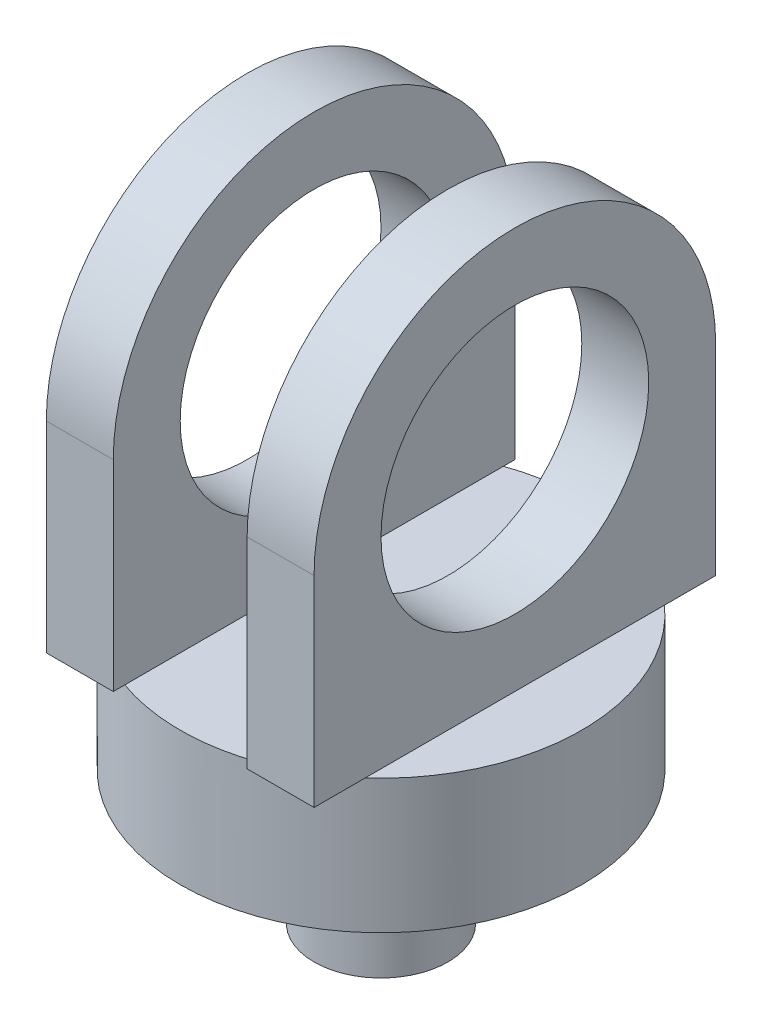
ISO-10303-21;
HEADER;
FILE_DESCRIPTION(('STEP AP214'),'2;1');
FILE_NAME('part.step','',(''),(''),'','','');
FILE_SCHEMA(('AUTOMOTIVE_DESIGN { 1 0 10303 214 1 1 1 1 }'));
ENDSEC;
DATA;
#1=APPLICATION_CONTEXT('core data for automotive mechanical design processes');
#2=APPLICATION_PROTOCOL_DEFINITION('international standard','automotive_design',2000,#1);
#3=PRODUCT_CONTEXT('',#1,'mechanical');
#4=PRODUCT('Part','Part','',(#3));
#5=PRODUCT_RELATED_PRODUCT_CATEGORY('part','',(#4));
#6=PRODUCT_DEFINITION_FORMATION('','',#4);
#7=PRODUCT_DEFINITION_CONTEXT('part definition',#1,'design');
#8=PRODUCT_DEFINITION('design','',#6,#7);
#9=PRODUCT_DEFINITION_SHAPE('','',#8);
#10=(LENGTH_UNIT() NAMED_UNIT(*) SI_UNIT(.MILLI.,.METRE.));
#11=(NAMED_UNIT(*) PLANE_ANGLE_UNIT() SI_UNIT($,.RADIAN.));
#12=(NAMED_UNIT(*) SI_UNIT($,.STERADIAN.) SOLID_ANGLE_UNIT());
#13=UNCERTAINTY_MEASURE_WITH_UNIT(LENGTH_MEASURE(1.E-05),#10,'distance_accuracy_value','');
#14=(GEOMETRIC_REPRESENTATION_CONTEXT(3) GLOBAL_UNCERTAINTY_ASSIGNED_CONTEXT((#13)) GLOBAL_UNIT_ASSIGNED_CONTEXT((#10,
#11,#12)) REPRESENTATION_CONTEXT('',''));
#15=CARTESIAN_POINT('',(0.,0.,0.));
#16=DIRECTION('',(0.,0.,1.));
#17=DIRECTION('',(1.,0.,0.));
#18=AXIS2_PLACEMENT_3D('',#15,#16,#17);
#19=CARTESIAN_POINT('',(0.,25.4,0.));
#20=DIRECTION('',(0.,1.,0.));
#21=DIRECTION('',(0.,0.,1.));
#22=AXIS2_PLACEMENT_3D('',#19,#20,#21);
#23=PLANE('',#22);
#24=CARTESIAN_POINT('',(0.,25.4,0.));
#25=DIRECTION('',(0.,1.,0.));
#26=DIRECTION('',(0.,0.,1.));
#27=AXIS2_PLACEMENT_3D('',#24,#25,#26);
#28=CIRCLE('',#27,19.05);
#29=CARTESIAN_POINT('',(-12.7,25.4,-14.1990316571237));
#30=VERTEX_POINT('',#29);
#31=CARTESIAN_POINT('',(-12.7,25.4,14.1990316571237));
#32=VERTEX_POINT('',#31);
#33=EDGE_CURVE('E401',#30,#32,#28,.T.);
#34=ORIENTED_EDGE('',*,*,#33,.T.);
#35=DIRECTION('',(0.,0.,-1.));
#36=VECTOR('',#35,1.);
#37=CARTESIAN_POINT('',(-12.7,25.4,19.05));
#38=LINE('',#37,#36);
#39=EDGE_CURVE('E178',#32,#30,#38,.T.);
#40=ORIENTED_EDGE('',*,*,#39,.T.);
#41=EDGE_LOOP('',(#34,#40));
#42=FACE_BOUND('',#41,.T.);
#43=ADVANCED_FACE('F44',(#42),#23,.T.);
#44=DIRECTION('',(0.,0.,-1.));
#45=VECTOR('',#44,1.);
#46=CARTESIAN_POINT('',(-6.35,25.4,19.05));
#47=LINE('',#46,#45);
#48=CARTESIAN_POINT('',(-6.35,25.4,17.9605122421383));
#49=VERTEX_POINT('',#48);
#50=CARTESIAN_POINT('',(-6.35,25.4,-17.9605122421383));
#51=VERTEX_POINT('',#50);
#52=EDGE_CURVE('E169',#49,#51,#47,.T.);
#53=ORIENTED_EDGE('',*,*,#52,.F.);
#54=CARTESIAN_POINT('',(6.35,25.4,17.9605122421383));
#55=VERTEX_POINT('',#54);
#56=EDGE_CURVE('E258',#49,#55,#28,.T.);
#57=ORIENTED_EDGE('',*,*,#56,.T.);
#58=DIRECTION('',(0.,0.,-1.));
#59=VECTOR('',#58,1.);
#60=CARTESIAN_POINT('',(6.35,25.4,19.05));
#61=LINE('',#60,#59);
#62=CARTESIAN_POINT('',(6.35,25.4,-17.9605122421383));
#63=VERTEX_POINT('',#62);
#64=EDGE_CURVE('E11',#55,#63,#61,.T.);
#65=ORIENTED_EDGE('',*,*,#64,.T.);
#66=EDGE_CURVE('E408',#63,#51,#28,.T.);
#67=ORIENTED_EDGE('',*,*,#66,.T.);
#68=EDGE_LOOP('',(#53,#57,#65,#67));
#69=FACE_BOUND('',#68,.T.);
#70=ADVANCED_FACE('F285',(#69),#23,.T.);
#71=CARTESIAN_POINT('',(0.,12.7,0.));
#72=DIRECTION('',(0.,-1.,0.));
#73=DIRECTION('',(0.,0.,-1.));
#74=AXIS2_PLACEMENT_3D('',#71,#72,#73);
#75=CYLINDRICAL_SURFACE('',#74,6.35);
#76=CARTESIAN_POINT('',(0.,12.7,0.));
#77=DIRECTION('',(0.,1.,0.));
#78=DIRECTION('',(0.,0.,1.));
#79=AXIS2_PLACEMENT_3D('',#76,#77,#78);
#80=CIRCLE('',#79,6.35);
#81=CARTESIAN_POINT('',(0.,12.7,6.35));
#82=VERTEX_POINT('',#81);
#83=EDGE_CURVE('E259',#82,#82,#80,.T.);
#84=ORIENTED_EDGE('',*,*,#83,.F.);
#85=EDGE_LOOP('',(#84));
#86=FACE_BOUND('',#85,.T.);
#87=CARTESIAN_POINT('',(0.,0.,0.));
#88=DIRECTION('',(0.,1.,0.));
#89=DIRECTION('',(0.,0.,1.));
#90=AXIS2_PLACEMENT_3D('',#87,#88,#89);
#91=CIRCLE('',#90,6.35);
#92=CARTESIAN_POINT('',(0.,0.,6.35));
#93=VERTEX_POINT('',#92);
#94=EDGE_CURVE('E47',#93,#93,#91,.T.);
#95=ORIENTED_EDGE('',*,*,#94,.T.);
#96=EDGE_LOOP('',(#95));
#97=FACE_BOUND('',#96,.T.);
#98=ADVANCED_FACE('F50',(#86,#97),#75,.T.);
#99=CARTESIAN_POINT('',(0.,0.,0.));
#100=DIRECTION('',(0.,1.,0.));
#101=DIRECTION('',(0.,0.,1.));
#102=AXIS2_PLACEMENT_3D('',#99,#100,#101);
#103=PLANE('',#102);
#104=ORIENTED_EDGE('',*,*,#94,.F.);
#105=EDGE_LOOP('',(#104));
#106=FACE_BOUND('',#105,.T.);
#107=ADVANCED_FACE('F271',(#106),#103,.F.);
#108=CARTESIAN_POINT('',(0.,25.4,0.));
#109=DIRECTION('',(0.,-1.,0.));
#110=DIRECTION('',(0.,0.,-1.));
#111=AXIS2_PLACEMENT_3D('',#108,#109,#110);
#112=CYLINDRICAL_SURFACE('',#111,19.05);
#113=CARTESIAN_POINT('',(12.7,25.4,14.1990316571237));
#114=VERTEX_POINT('',#113);
#115=EDGE_CURVE('E253',#55,#114,#28,.T.);
#116=ORIENTED_EDGE('',*,*,#115,.F.);
#117=ORIENTED_EDGE('',*,*,#56,.F.);
#118=EDGE_CURVE('E402',#32,#49,#28,.T.);
#119=ORIENTED_EDGE('',*,*,#118,.F.);
#120=ORIENTED_EDGE('',*,*,#33,.F.);
#121=EDGE_CURVE('E342',#51,#30,#28,.T.);
#122=ORIENTED_EDGE('',*,*,#121,.F.);
#123=ORIENTED_EDGE('',*,*,#66,.F.);
#124=CARTESIAN_POINT('',(12.7,25.4,-14.1990316571237));
#125=VERTEX_POINT('',#124);
#126=EDGE_CURVE('E306',#125,#63,#28,.T.);
#127=ORIENTED_EDGE('',*,*,#126,.F.);
#128=EDGE_CURVE('E254',#114,#125,#28,.T.);
#129=ORIENTED_EDGE('',*,*,#128,.F.);
#130=EDGE_LOOP('',(#116,#117,#119,#120,#122,#123,#127,#129));
#131=FACE_BOUND('',#130,.T.);
#132=CARTESIAN_POINT('',(0.,12.7,0.));
#133=DIRECTION('',(0.,1.,0.));
#134=DIRECTION('',(0.,0.,1.));
#135=AXIS2_PLACEMENT_3D('',#132,#133,#134);
#136=CIRCLE('',#135,19.05);
#137=CARTESIAN_POINT('',(0.,12.7,19.05));
#138=VERTEX_POINT('',#137);
#139=EDGE_CURVE('E248',#138,#138,#136,.T.);
#140=ORIENTED_EDGE('',*,*,#139,.T.);
#141=EDGE_LOOP('',(#140));
#142=FACE_BOUND('',#141,.T.);
#143=ADVANCED_FACE('F272',(#131,#142),#112,.T.);
#144=DIRECTION('',(0.,0.,-1.));
#145=VECTOR('',#144,1.);
#146=CARTESIAN_POINT('',(12.7,25.4,19.05));
#147=LINE('',#146,#145);
#148=EDGE_CURVE('E54',#114,#125,#147,.T.);
#149=ORIENTED_EDGE('',*,*,#148,.F.);
#150=ORIENTED_EDGE('',*,*,#128,.T.);
#151=EDGE_LOOP('',(#149,#150));
#152=FACE_BOUND('',#151,.T.);
#153=ADVANCED_FACE('F276',(#152),#23,.T.);
#154=CARTESIAN_POINT('',(0.,12.7,0.));
#155=DIRECTION('',(0.,1.,0.));
#156=DIRECTION('',(0.,0.,1.));
#157=AXIS2_PLACEMENT_3D('',#154,#155,#156);
#158=PLANE('',#157);
#159=ORIENTED_EDGE('',*,*,#83,.T.);
#160=EDGE_LOOP('',(#159));
#161=FACE_BOUND('',#160,.T.);
#162=ORIENTED_EDGE('',*,*,#139,.F.);
#163=EDGE_LOOP('',(#162));
#164=FACE_BOUND('',#163,.T.);
#165=ADVANCED_FACE('F293',(#161,#164),#158,.F.);
#166=CARTESIAN_POINT('',(12.7,25.4,19.05));
#167=DIRECTION('',(0.,1.,0.));
#168=DIRECTION('',(0.,0.,1.));
#169=AXIS2_PLACEMENT_3D('',#166,#167,#168);
#170=PLANE('',#169);
#171=CARTESIAN_POINT('',(6.35,25.4,19.05));
#172=VERTEX_POINT('',#171);
#173=EDGE_CURVE('E60',#172,#55,#61,.T.);
#174=ORIENTED_EDGE('',*,*,#173,.T.);
#175=ORIENTED_EDGE('',*,*,#115,.T.);
#176=CARTESIAN_POINT('',(12.7,25.4,19.05));
#177=VERTEX_POINT('',#176);
#178=EDGE_CURVE('E213',#177,#114,#147,.T.);
#179=ORIENTED_EDGE('',*,*,#178,.F.);
#180=DIRECTION('',(-1.,0.,0.));
#181=VECTOR('',#180,1.);
#182=CARTESIAN_POINT('',(12.7,25.4,19.05));
#183=LINE('',#182,#181);
#184=EDGE_CURVE('E247',#177,#172,#183,.T.);
#185=ORIENTED_EDGE('',*,*,#184,.T.);
#186=EDGE_LOOP('',(#174,#175,#179,#185));
#187=FACE_BOUND('',#186,.T.);
#188=ADVANCED_FACE('F297',(#187),#170,.F.);
#189=CARTESIAN_POINT('',(12.7,25.4,-19.05));
#190=VERTEX_POINT('',#189);
#191=EDGE_CURVE('E211',#125,#190,#147,.T.);
#192=ORIENTED_EDGE('',*,*,#191,.F.);
#193=ORIENTED_EDGE('',*,*,#126,.T.);
#194=CARTESIAN_POINT('',(6.35,25.4,-19.05));
#195=VERTEX_POINT('',#194);
#196=EDGE_CURVE('E59',#63,#195,#61,.T.);
#197=ORIENTED_EDGE('',*,*,#196,.T.);
#198=DIRECTION('',(-1.,0.,0.));
#199=VECTOR('',#198,1.);
#200=CARTESIAN_POINT('',(12.7,25.4,-19.05));
#201=LINE('',#200,#199);
#202=EDGE_CURVE('E245',#190,#195,#201,.T.);
#203=ORIENTED_EDGE('',*,*,#202,.F.);
#204=EDGE_LOOP('',(#192,#193,#197,#203));
#205=FACE_BOUND('',#204,.T.);
#206=ADVANCED_FACE('F393',(#205),#170,.F.);
#207=CARTESIAN_POINT('',(12.7,44.45,19.05));
#208=DIRECTION('',(0.,0.,-1.));
#209=DIRECTION('',(-1.,0.,0.));
#210=AXIS2_PLACEMENT_3D('',#207,#208,#209);
#211=PLANE('',#210);
#212=DIRECTION('',(0.,-1.,0.));
#213=VECTOR('',#212,1.);
#214=CARTESIAN_POINT('',(6.35,44.45,19.05));
#215=LINE('',#214,#213);
#216=CARTESIAN_POINT('',(6.35,44.45,19.05));
#217=VERTEX_POINT('',#216);
#218=EDGE_CURVE('E201',#217,#172,#215,.T.);
#219=ORIENTED_EDGE('',*,*,#218,.T.);
#220=ORIENTED_EDGE('',*,*,#184,.F.);
#221=DIRECTION('',(0.,-1.,0.));
#222=VECTOR('',#221,1.);
#223=CARTESIAN_POINT('',(12.7,44.45,19.05));
#224=LINE('',#223,#222);
#225=CARTESIAN_POINT('',(12.7,44.45,19.05));
#226=VERTEX_POINT('',#225);
#227=EDGE_CURVE('E210',#226,#177,#224,.T.);
#228=ORIENTED_EDGE('',*,*,#227,.F.);
#229=DIRECTION('',(-1.,0.,0.));
#230=VECTOR('',#229,1.);
#231=CARTESIAN_POINT('',(12.7,44.45,19.05));
#232=LINE('',#231,#230);
#233=EDGE_CURVE('E221',#226,#217,#232,.T.);
#234=ORIENTED_EDGE('',*,*,#233,.T.);
#235=EDGE_LOOP('',(#219,#220,#228,#234));
#236=FACE_BOUND('',#235,.T.);
#237=ADVANCED_FACE('F320',(#236),#211,.F.);
#238=CARTESIAN_POINT('',(12.7,25.4,-19.05));
#239=DIRECTION('',(0.,0.,1.));
#240=DIRECTION('',(1.,0.,0.));
#241=AXIS2_PLACEMENT_3D('',#238,#239,#240);
#242=PLANE('',#241);
#243=DIRECTION('',(0.,1.,0.));
#244=VECTOR('',#243,1.);
#245=CARTESIAN_POINT('',(6.35,25.4,-19.05));
#246=LINE('',#245,#244);
#247=CARTESIAN_POINT('',(6.35,44.45,-19.05));
#248=VERTEX_POINT('',#247);
#249=EDGE_CURVE('E227',#195,#248,#246,.T.);
#250=ORIENTED_EDGE('',*,*,#249,.T.);
#251=DIRECTION('',(-1.,0.,0.));
#252=VECTOR('',#251,1.);
#253=CARTESIAN_POINT('',(12.7,44.45,-19.05));
#254=LINE('',#253,#252);
#255=CARTESIAN_POINT('',(12.7,44.45,-19.05));
#256=VERTEX_POINT('',#255);
#257=EDGE_CURVE('E239',#256,#248,#254,.T.);
#258=ORIENTED_EDGE('',*,*,#257,.F.);
#259=DIRECTION('',(0.,1.,0.));
#260=VECTOR('',#259,1.);
#261=CARTESIAN_POINT('',(12.7,25.4,-19.05));
#262=LINE('',#261,#260);
#263=EDGE_CURVE('E220',#190,#256,#262,.T.);
#264=ORIENTED_EDGE('',*,*,#263,.F.);
#265=ORIENTED_EDGE('',*,*,#202,.T.);
#266=EDGE_LOOP('',(#250,#258,#264,#265));
#267=FACE_BOUND('',#266,.T.);
#268=ADVANCED_FACE('F327',(#267),#242,.F.);
#269=CARTESIAN_POINT('',(12.7,44.45,0.));
#270=DIRECTION('',(-1.,0.,0.));
#271=DIRECTION('',(0.,0.,1.));
#272=AXIS2_PLACEMENT_3D('',#269,#270,#271);
#273=CYLINDRICAL_SURFACE('',#272,19.05);
#274=CARTESIAN_POINT('',(6.35,44.45,0.));
#275=DIRECTION('',(-1.,0.,0.));
#276=DIRECTION('',(0.,0.,1.));
#277=AXIS2_PLACEMENT_3D('',#274,#275,#276);
#278=CIRCLE('',#277,19.05);
#279=EDGE_CURVE('E215',#217,#248,#278,.T.);
#280=ORIENTED_EDGE('',*,*,#279,.F.);
#281=ORIENTED_EDGE('',*,*,#233,.F.);
#282=CARTESIAN_POINT('',(12.7,44.45,0.));
#283=DIRECTION('',(-1.,0.,0.));
#284=DIRECTION('',(0.,0.,1.));
#285=AXIS2_PLACEMENT_3D('',#282,#283,#284);
#286=CIRCLE('',#285,19.05);
#287=EDGE_CURVE('E219',#226,#256,#286,.T.);
#288=ORIENTED_EDGE('',*,*,#287,.T.);
#289=ORIENTED_EDGE('',*,*,#257,.T.);
#290=EDGE_LOOP('',(#280,#281,#288,#289));
#291=FACE_BOUND('',#290,.T.);
#292=ADVANCED_FACE('F322',(#291),#273,.T.);
#293=CARTESIAN_POINT('',(12.7,44.45,0.));
#294=DIRECTION('',(-1.,0.,0.));
#295=DIRECTION('',(0.,0.,1.));
#296=AXIS2_PLACEMENT_3D('',#293,#294,#295);
#297=PLANE('',#296);
#298=CARTESIAN_POINT('',(12.7,44.45,0.));
#299=DIRECTION('',(-1.,0.,0.));
#300=DIRECTION('',(0.,0.,1.));
#301=AXIS2_PLACEMENT_3D('',#298,#299,#300);
#302=CIRCLE('',#301,12.7);
#303=CARTESIAN_POINT('',(12.7,44.45,12.7));
#304=VERTEX_POINT('',#303);
#305=EDGE_CURVE('E200',#304,#304,#302,.T.);
#306=ORIENTED_EDGE('',*,*,#305,.T.);
#307=EDGE_LOOP('',(#306));
#308=FACE_BOUND('',#307,.T.);
#309=ORIENTED_EDGE('',*,*,#227,.T.);
#310=ORIENTED_EDGE('',*,*,#178,.T.);
#311=ORIENTED_EDGE('',*,*,#148,.T.);
#312=ORIENTED_EDGE('',*,*,#191,.T.);
#313=ORIENTED_EDGE('',*,*,#263,.T.);
#314=ORIENTED_EDGE('',*,*,#287,.F.);
#315=EDGE_LOOP('',(#309,#310,#311,#312,#313,#314));
#316=FACE_BOUND('',#315,.T.);
#317=ADVANCED_FACE('F315',(#308,#316),#297,.F.);
#318=CARTESIAN_POINT('',(6.35,44.45,0.));
#319=DIRECTION('',(-1.,0.,0.));
#320=DIRECTION('',(0.,0.,1.));
#321=AXIS2_PLACEMENT_3D('',#318,#319,#320);
#322=PLANE('',#321);
#323=CARTESIAN_POINT('',(6.35,44.45,0.));
#324=DIRECTION('',(-1.,0.,0.));
#325=DIRECTION('',(0.,0.,1.));
#326=AXIS2_PLACEMENT_3D('',#323,#324,#325);
#327=CIRCLE('',#326,12.7);
#328=CARTESIAN_POINT('',(6.35,44.45,12.7));
#329=VERTEX_POINT('',#328);
#330=EDGE_CURVE('E147',#329,#329,#327,.T.);
#331=ORIENTED_EDGE('',*,*,#330,.F.);
#332=EDGE_LOOP('',(#331));
#333=FACE_BOUND('',#332,.T.);
#334=ORIENTED_EDGE('',*,*,#218,.F.);
#335=ORIENTED_EDGE('',*,*,#279,.T.);
#336=ORIENTED_EDGE('',*,*,#249,.F.);
#337=ORIENTED_EDGE('',*,*,#196,.F.);
#338=ORIENTED_EDGE('',*,*,#64,.F.);
#339=ORIENTED_EDGE('',*,*,#173,.F.);
#340=EDGE_LOOP('',(#334,#335,#336,#337,#338,#339));
#341=FACE_BOUND('',#340,.T.);
#342=ADVANCED_FACE('F321',(#333,#341),#322,.T.);
#343=CARTESIAN_POINT('',(12.7,44.45,0.));
#344=DIRECTION('',(-1.,0.,0.));
#345=DIRECTION('',(0.,0.,1.));
#346=AXIS2_PLACEMENT_3D('',#343,#344,#345);
#347=CYLINDRICAL_SURFACE('',#346,12.7);
#348=ORIENTED_EDGE('',*,*,#305,.F.);
#349=EDGE_LOOP('',(#348));
#350=FACE_BOUND('',#349,.T.);
#351=ORIENTED_EDGE('',*,*,#330,.T.);
#352=EDGE_LOOP('',(#351));
#353=FACE_BOUND('',#352,.T.);
#354=ADVANCED_FACE('F375',(#350,#353),#347,.F.);
#355=CARTESIAN_POINT('',(-12.7,25.4,19.05));
#356=DIRECTION('',(0.,-1.,0.));
#357=DIRECTION('',(0.,0.,-1.));
#358=AXIS2_PLACEMENT_3D('',#355,#356,#357);
#359=PLANE('',#358);
#360=CARTESIAN_POINT('',(-6.35,25.4,-19.05));
#361=VERTEX_POINT('',#360);
#362=EDGE_CURVE('E168',#51,#361,#47,.T.);
#363=ORIENTED_EDGE('',*,*,#362,.F.);
#364=ORIENTED_EDGE('',*,*,#121,.T.);
#365=CARTESIAN_POINT('',(-12.7,25.4,-19.05));
#366=VERTEX_POINT('',#365);
#367=EDGE_CURVE('E62',#30,#366,#38,.T.);
#368=ORIENTED_EDGE('',*,*,#367,.T.);
#369=DIRECTION('',(1.,0.,0.));
#370=VECTOR('',#369,1.);
#371=CARTESIAN_POINT('',(-12.7,25.4,-19.05));
#372=LINE('',#371,#370);
#373=EDGE_CURVE('E194',#366,#361,#372,.T.);
#374=ORIENTED_EDGE('',*,*,#373,.T.);
#375=EDGE_LOOP('',(#363,#364,#368,#374));
#376=FACE_BOUND('',#375,.T.);
#377=ADVANCED_FACE('F336',(#376),#359,.T.);
#378=CARTESIAN_POINT('',(-12.7,25.4,19.05));
#379=VERTEX_POINT('',#378);
#380=EDGE_CURVE('E165',#379,#32,#38,.T.);
#381=ORIENTED_EDGE('',*,*,#380,.T.);
#382=ORIENTED_EDGE('',*,*,#118,.T.);
#383=CARTESIAN_POINT('',(-6.35,25.4,19.05));
#384=VERTEX_POINT('',#383);
#385=EDGE_CURVE('E163',#384,#49,#47,.T.);
#386=ORIENTED_EDGE('',*,*,#385,.F.);
#387=DIRECTION('',(1.,0.,0.));
#388=VECTOR('',#387,1.);
#389=CARTESIAN_POINT('',(-12.7,25.4,19.05));
#390=LINE('',#389,#388);
#391=EDGE_CURVE('E176',#379,#384,#390,.T.);
#392=ORIENTED_EDGE('',*,*,#391,.F.);
#393=EDGE_LOOP('',(#381,#382,#386,#392));
#394=FACE_BOUND('',#393,.T.);
#395=ADVANCED_FACE('F371',(#394),#359,.T.);
#396=CARTESIAN_POINT('',(-12.7,44.45,19.05));
#397=DIRECTION('',(0.,0.,1.));
#398=DIRECTION('',(1.,0.,0.));
#399=AXIS2_PLACEMENT_3D('',#396,#397,#398);
#400=PLANE('',#399);
#401=DIRECTION('',(0.,-1.,0.));
#402=VECTOR('',#401,1.);
#403=CARTESIAN_POINT('',(-6.35,44.45,19.05));
#404=LINE('',#403,#402);
#405=CARTESIAN_POINT('',(-6.35,44.45,19.05));
#406=VERTEX_POINT('',#405);
#407=EDGE_CURVE('E144',#406,#384,#404,.T.);
#408=ORIENTED_EDGE('',*,*,#407,.F.);
#409=DIRECTION('',(1.,0.,0.));
#410=VECTOR('',#409,1.);
#411=CARTESIAN_POINT('',(-12.7,44.45,19.05));
#412=LINE('',#411,#410);
#413=CARTESIAN_POINT('',(-12.7,44.45,19.05));
#414=VERTEX_POINT('',#413);
#415=EDGE_CURVE('E139',#414,#406,#412,.T.);
#416=ORIENTED_EDGE('',*,*,#415,.F.);
#417=DIRECTION('',(0.,-1.,0.));
#418=VECTOR('',#417,1.);
#419=CARTESIAN_POINT('',(-12.7,44.45,19.05));
#420=LINE('',#419,#418);
#421=EDGE_CURVE('E142',#414,#379,#420,.T.);
#422=ORIENTED_EDGE('',*,*,#421,.T.);
#423=ORIENTED_EDGE('',*,*,#391,.T.);
#424=EDGE_LOOP('',(#408,#416,#422,#423));
#425=FACE_BOUND('',#424,.T.);
#426=ADVANCED_FACE('F138',(#425),#400,.T.);
#427=CARTESIAN_POINT('',(-12.7,44.45,0.));
#428=DIRECTION('',(1.,0.,0.));
#429=DIRECTION('',(0.,0.,-1.));
#430=AXIS2_PLACEMENT_3D('',#427,#428,#429);
#431=CYLINDRICAL_SURFACE('',#430,19.05);
#432=CARTESIAN_POINT('',(-6.35,44.45,0.));
#433=DIRECTION('',(-1.,0.,0.));
#434=DIRECTION('',(0.,0.,1.));
#435=AXIS2_PLACEMENT_3D('',#432,#433,#434);
#436=CIRCLE('',#435,19.05);
#437=CARTESIAN_POINT('',(-6.35,44.45,-19.05));
#438=VERTEX_POINT('',#437);
#439=EDGE_CURVE('E181',#406,#438,#436,.T.);
#440=ORIENTED_EDGE('',*,*,#439,.T.);
#441=DIRECTION('',(1.,0.,0.));
#442=VECTOR('',#441,1.);
#443=CARTESIAN_POINT('',(-12.7,44.45,-19.05));
#444=LINE('',#443,#442);
#445=CARTESIAN_POINT('',(-12.7,44.45,-19.05));
#446=VERTEX_POINT('',#445);
#447=EDGE_CURVE('E151',#446,#438,#444,.T.);
#448=ORIENTED_EDGE('',*,*,#447,.F.);
#449=CARTESIAN_POINT('',(-12.7,44.45,0.));
#450=DIRECTION('',(-1.,0.,0.));
#451=DIRECTION('',(0.,0.,1.));
#452=AXIS2_PLACEMENT_3D('',#449,#450,#451);
#453=CIRCLE('',#452,19.05);
#454=EDGE_CURVE('E152',#414,#446,#453,.T.);
#455=ORIENTED_EDGE('',*,*,#454,.F.);
#456=ORIENTED_EDGE('',*,*,#415,.T.);
#457=EDGE_LOOP('',(#440,#448,#455,#456));
#458=FACE_BOUND('',#457,.T.);
#459=ADVANCED_FACE('F154',(#458),#431,.T.);
#460=CARTESIAN_POINT('',(-12.7,25.4,-19.05));
#461=DIRECTION('',(0.,0.,-1.));
#462=DIRECTION('',(-1.,0.,0.));
#463=AXIS2_PLACEMENT_3D('',#460,#461,#462);
#464=PLANE('',#463);
#465=DIRECTION('',(0.,1.,0.));
#466=VECTOR('',#465,1.);
#467=CARTESIAN_POINT('',(-6.35,25.4,-19.05));
#468=LINE('',#467,#466);
#469=EDGE_CURVE('E190',#361,#438,#468,.T.);
#470=ORIENTED_EDGE('',*,*,#469,.F.);
#471=ORIENTED_EDGE('',*,*,#373,.F.);
#472=DIRECTION('',(0.,1.,0.));
#473=VECTOR('',#472,1.);
#474=CARTESIAN_POINT('',(-12.7,25.4,-19.05));
#475=LINE('',#474,#473);
#476=EDGE_CURVE('E158',#366,#446,#475,.T.);
#477=ORIENTED_EDGE('',*,*,#476,.T.);
#478=ORIENTED_EDGE('',*,*,#447,.T.);
#479=EDGE_LOOP('',(#470,#471,#477,#478));
#480=FACE_BOUND('',#479,.T.);
#481=ADVANCED_FACE('F344',(#480),#464,.T.);
#482=CARTESIAN_POINT('',(-12.7,44.45,0.));
#483=DIRECTION('',(1.,0.,0.));
#484=DIRECTION('',(0.,0.,1.));
#485=AXIS2_PLACEMENT_3D('',#482,#483,#484);
#486=PLANE('',#485);
#487=CARTESIAN_POINT('',(-12.7,44.45,0.));
#488=DIRECTION('',(-1.,0.,0.));
#489=DIRECTION('',(0.,0.,1.));
#490=AXIS2_PLACEMENT_3D('',#487,#488,#489);
#491=CIRCLE('',#490,12.7);
#492=CARTESIAN_POINT('',(-12.7,44.45,12.7));
#493=VERTEX_POINT('',#492);
#494=EDGE_CURVE('E184',#493,#493,#491,.T.);
#495=ORIENTED_EDGE('',*,*,#494,.F.);
#496=EDGE_LOOP('',(#495));
#497=FACE_BOUND('',#496,.T.);
#498=ORIENTED_EDGE('',*,*,#421,.F.);
#499=ORIENTED_EDGE('',*,*,#454,.T.);
#500=ORIENTED_EDGE('',*,*,#476,.F.);
#501=ORIENTED_EDGE('',*,*,#367,.F.);
#502=ORIENTED_EDGE('',*,*,#39,.F.);
#503=ORIENTED_EDGE('',*,*,#380,.F.);
#504=EDGE_LOOP('',(#498,#499,#500,#501,#502,#503));
#505=FACE_BOUND('',#504,.T.);
#506=ADVANCED_FACE('F159',(#497,#505),#486,.F.);
#507=CARTESIAN_POINT('',(-6.35,44.45,0.));
#508=DIRECTION('',(1.,0.,0.));
#509=DIRECTION('',(0.,0.,1.));
#510=AXIS2_PLACEMENT_3D('',#507,#508,#509);
#511=PLANE('',#510);
#512=CARTESIAN_POINT('',(-6.35,44.45,0.));
#513=DIRECTION('',(-1.,0.,0.));
#514=DIRECTION('',(0.,0.,1.));
#515=AXIS2_PLACEMENT_3D('',#512,#513,#514);
#516=CIRCLE('',#515,12.7);
#517=CARTESIAN_POINT('',(-6.35,44.45,12.7));
#518=VERTEX_POINT('',#517);
#519=EDGE_CURVE('E175',#518,#518,#516,.T.);
#520=ORIENTED_EDGE('',*,*,#519,.T.);
#521=EDGE_LOOP('',(#520));
#522=FACE_BOUND('',#521,.T.);
#523=ORIENTED_EDGE('',*,*,#407,.T.);
#524=ORIENTED_EDGE('',*,*,#385,.T.);
#525=ORIENTED_EDGE('',*,*,#52,.T.);
#526=ORIENTED_EDGE('',*,*,#362,.T.);
#527=ORIENTED_EDGE('',*,*,#469,.T.);
#528=ORIENTED_EDGE('',*,*,#439,.F.);
#529=EDGE_LOOP('',(#523,#524,#525,#526,#527,#528));
#530=FACE_BOUND('',#529,.T.);
#531=ADVANCED_FACE('F343',(#522,#530),#511,.T.);
#532=CARTESIAN_POINT('',(-12.7,44.45,0.));
#533=DIRECTION('',(1.,0.,0.));
#534=DIRECTION('',(0.,0.,-1.));
#535=AXIS2_PLACEMENT_3D('',#532,#533,#534);
#536=CYLINDRICAL_SURFACE('',#535,12.7);
#537=ORIENTED_EDGE('',*,*,#494,.T.);
#538=EDGE_LOOP('',(#537));
#539=FACE_BOUND('',#538,.T.);
#540=ORIENTED_EDGE('',*,*,#519,.F.);
#541=EDGE_LOOP('',(#540));
#542=FACE_BOUND('',#541,.T.);
#543=ADVANCED_FACE('F360',(#539,#542),#536,.F.);
#544=CLOSED_SHELL('',(#43,#70,#98,#107,#143,#153,#165,#188,#206,#237,#268,#292,#317,#342,#354,
#377,#395,#426,#459,#481,#506,#531,#543));
#545=MANIFOLD_SOLID_BREP('B2',#544);
#546=ADVANCED_BREP_SHAPE_REPRESENTATION('',(#18,#545),#14);
#547=SHAPE_DEFINITION_REPRESENTATION(#9,#546);
ENDSEC;
END-ISO-10303-21;
